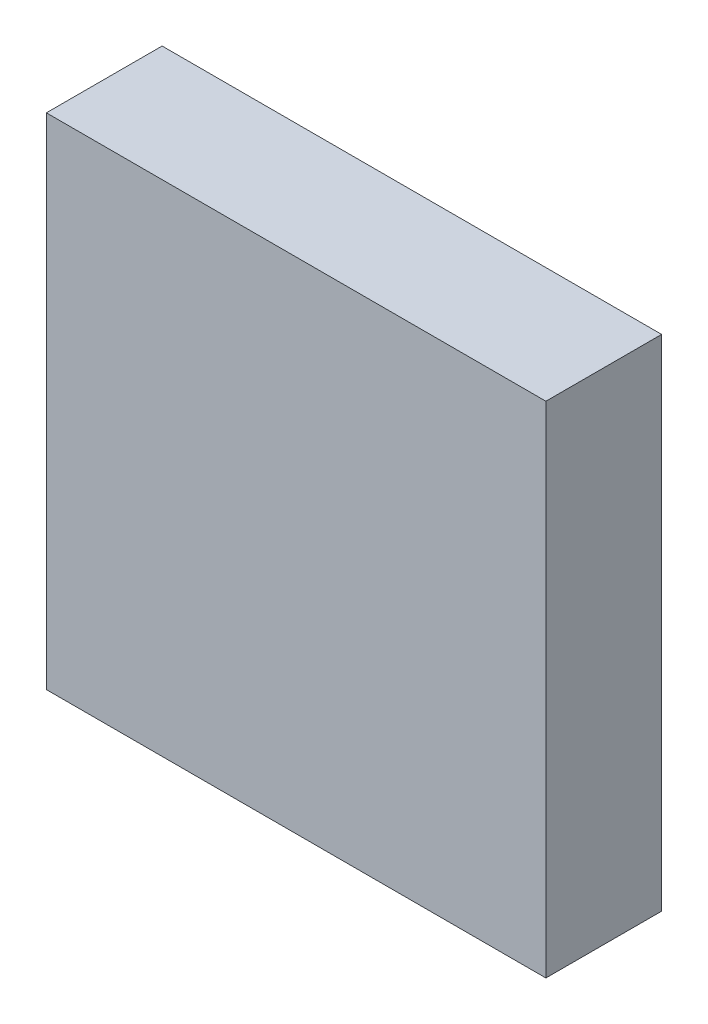
ISO-10303-21;
HEADER;
FILE_DESCRIPTION(('STEP AP214'),'2;1');
FILE_NAME('part.step','',(''),(''),'','','');
FILE_SCHEMA(('AUTOMOTIVE_DESIGN { 1 0 10303 214 1 1 1 1 }'));
ENDSEC;
DATA;
#1=APPLICATION_CONTEXT('core data for automotive mechanical design processes');
#2=APPLICATION_PROTOCOL_DEFINITION('international standard','automotive_design',2000,#1);
#3=PRODUCT_CONTEXT('',#1,'mechanical');
#4=PRODUCT('Part','Part','',(#3));
#5=PRODUCT_RELATED_PRODUCT_CATEGORY('part','',(#4));
#6=PRODUCT_DEFINITION_FORMATION('','',#4);
#7=PRODUCT_DEFINITION_CONTEXT('part definition',#1,'design');
#8=PRODUCT_DEFINITION('design','',#6,#7);
#9=PRODUCT_DEFINITION_SHAPE('','',#8);
#10=(LENGTH_UNIT() NAMED_UNIT(*) SI_UNIT(.MILLI.,.METRE.));
#11=(NAMED_UNIT(*) PLANE_ANGLE_UNIT() SI_UNIT($,.RADIAN.));
#12=(NAMED_UNIT(*) SI_UNIT($,.STERADIAN.) SOLID_ANGLE_UNIT());
#13=UNCERTAINTY_MEASURE_WITH_UNIT(LENGTH_MEASURE(1.E-05),#10,'distance_accuracy_value','');
#14=(GEOMETRIC_REPRESENTATION_CONTEXT(3) GLOBAL_UNCERTAINTY_ASSIGNED_CONTEXT((#13)) GLOBAL_UNIT_ASSIGNED_CONTEXT((#10,
#11,#12)) REPRESENTATION_CONTEXT('',''));
#15=CARTESIAN_POINT('',(0.,0.,0.));
#16=DIRECTION('',(0.,0.,1.));
#17=DIRECTION('',(1.,0.,0.));
#18=AXIS2_PLACEMENT_3D('',#15,#16,#17);
#19=CARTESIAN_POINT('',(2.05000098,-2.05000098,0.95000064));
#20=DIRECTION('',(0.,0.,1.));
#21=DIRECTION('',(1.,0.,0.));
#22=AXIS2_PLACEMENT_3D('',#19,#20,#21);
#23=PLANE('',#22);
#24=DIRECTION('',(0.,1.,0.));
#25=VECTOR('',#24,1.);
#26=CARTESIAN_POINT('',(-2.05000098,-2.05000098,0.95000064));
#27=LINE('',#26,#25);
#28=CARTESIAN_POINT('',(-2.05000098,-2.05000098,0.95000064));
#29=VERTEX_POINT('',#28);
#30=CARTESIAN_POINT('',(-2.05000098,2.05000098,0.95000064));
#31=VERTEX_POINT('',#30);
#32=EDGE_CURVE('E53',#29,#31,#27,.T.);
#33=ORIENTED_EDGE('',*,*,#32,.F.);
#34=DIRECTION('',(1.,0.,0.));
#35=VECTOR('',#34,1.);
#36=CARTESIAN_POINT('',(2.05000098,-2.05000098,0.95000064));
#37=LINE('',#36,#35);
#38=CARTESIAN_POINT('',(2.05000098,-2.05000098,0.95000064));
#39=VERTEX_POINT('',#38);
#40=EDGE_CURVE('E68',#39,#29,#37,.F.);
#41=ORIENTED_EDGE('',*,*,#40,.F.);
#42=DIRECTION('',(0.,1.,0.));
#43=VECTOR('',#42,1.);
#44=CARTESIAN_POINT('',(2.05000098,2.05000098,0.95000064));
#45=LINE('',#44,#43);
#46=CARTESIAN_POINT('',(2.05000098,2.05000098,0.95000064));
#47=VERTEX_POINT('',#46);
#48=EDGE_CURVE('E20',#47,#39,#45,.F.);
#49=ORIENTED_EDGE('',*,*,#48,.F.);
#50=DIRECTION('',(1.,0.,0.));
#51=VECTOR('',#50,1.);
#52=CARTESIAN_POINT('',(-2.05000098,2.05000098,0.95000064));
#53=LINE('',#52,#51);
#54=EDGE_CURVE('E58',#31,#47,#53,.T.);
#55=ORIENTED_EDGE('',*,*,#54,.F.);
#56=EDGE_LOOP('',(#33,#41,#49,#55));
#57=FACE_BOUND('',#56,.T.);
#58=ADVANCED_FACE('F17',(#57),#23,.T.);
#59=CARTESIAN_POINT('',(2.05000098,2.05000098,0.));
#60=DIRECTION('',(1.,0.,0.));
#61=DIRECTION('',(0.,0.,-1.));
#62=AXIS2_PLACEMENT_3D('',#59,#60,#61);
#63=PLANE('',#62);
#64=DIRECTION('',(0.,0.,-1.));
#65=VECTOR('',#64,1.);
#66=CARTESIAN_POINT('',(2.05000098,-2.05000098,0.));
#67=LINE('',#66,#65);
#68=CARTESIAN_POINT('',(2.05000098,-2.05000098,0.));
#69=VERTEX_POINT('',#68);
#70=EDGE_CURVE('E79',#69,#39,#67,.F.);
#71=ORIENTED_EDGE('',*,*,#70,.F.);
#72=DIRECTION('',(0.,1.,0.));
#73=VECTOR('',#72,1.);
#74=CARTESIAN_POINT('',(2.05000098,-2.05000098,0.));
#75=LINE('',#74,#73);
#76=CARTESIAN_POINT('',(2.05000098,2.05000098,0.));
#77=VERTEX_POINT('',#76);
#78=EDGE_CURVE('E74',#69,#77,#75,.T.);
#79=ORIENTED_EDGE('',*,*,#78,.T.);
#80=DIRECTION('',(0.,0.,1.));
#81=VECTOR('',#80,1.);
#82=CARTESIAN_POINT('',(2.05000098,2.05000098,0.));
#83=LINE('',#82,#81);
#84=EDGE_CURVE('E63',#47,#77,#83,.F.);
#85=ORIENTED_EDGE('',*,*,#84,.F.);
#86=ORIENTED_EDGE('',*,*,#48,.T.);
#87=EDGE_LOOP('',(#71,#79,#85,#86));
#88=FACE_BOUND('',#87,.T.);
#89=ADVANCED_FACE('F73',(#88),#63,.T.);
#90=CARTESIAN_POINT('',(-2.05000098,2.05000098,0.));
#91=DIRECTION('',(0.,1.,0.));
#92=DIRECTION('',(0.,0.,1.));
#93=AXIS2_PLACEMENT_3D('',#90,#91,#92);
#94=PLANE('',#93);
#95=ORIENTED_EDGE('',*,*,#84,.T.);
#96=DIRECTION('',(1.,0.,0.));
#97=VECTOR('',#96,1.);
#98=CARTESIAN_POINT('',(2.05000098,2.05000098,0.));
#99=LINE('',#98,#97);
#100=CARTESIAN_POINT('',(-2.05000098,2.05000098,0.));
#101=VERTEX_POINT('',#100);
#102=EDGE_CURVE('E84',#77,#101,#99,.F.);
#103=ORIENTED_EDGE('',*,*,#102,.T.);
#104=DIRECTION('',(0.,0.,1.));
#105=VECTOR('',#104,1.);
#106=CARTESIAN_POINT('',(-2.05000098,2.05000098,0.));
#107=LINE('',#106,#105);
#108=EDGE_CURVE('E65',#31,#101,#107,.F.);
#109=ORIENTED_EDGE('',*,*,#108,.F.);
#110=ORIENTED_EDGE('',*,*,#54,.T.);
#111=EDGE_LOOP('',(#95,#103,#109,#110));
#112=FACE_BOUND('',#111,.T.);
#113=ADVANCED_FACE('F60',(#112),#94,.T.);
#114=CARTESIAN_POINT('',(-2.05000098,-2.05000098,0.));
#115=DIRECTION('',(-1.,0.,0.));
#116=DIRECTION('',(0.,0.,1.));
#117=AXIS2_PLACEMENT_3D('',#114,#115,#116);
#118=PLANE('',#117);
#119=ORIENTED_EDGE('',*,*,#108,.T.);
#120=DIRECTION('',(0.,1.,0.));
#121=VECTOR('',#120,1.);
#122=CARTESIAN_POINT('',(-2.05000098,-2.05000098,0.));
#123=LINE('',#122,#121);
#124=CARTESIAN_POINT('',(-2.05000098,-2.05000098,0.));
#125=VERTEX_POINT('',#124);
#126=EDGE_CURVE('E26',#101,#125,#123,.F.);
#127=ORIENTED_EDGE('',*,*,#126,.T.);
#128=DIRECTION('',(0.,0.,-1.));
#129=VECTOR('',#128,1.);
#130=CARTESIAN_POINT('',(-2.05000098,-2.05000098,0.));
#131=LINE('',#130,#129);
#132=EDGE_CURVE('E34',#29,#125,#131,.T.);
#133=ORIENTED_EDGE('',*,*,#132,.F.);
#134=ORIENTED_EDGE('',*,*,#32,.T.);
#135=EDGE_LOOP('',(#119,#127,#133,#134));
#136=FACE_BOUND('',#135,.T.);
#137=ADVANCED_FACE('F88',(#136),#118,.T.);
#138=CARTESIAN_POINT('',(2.05000098,-2.05000098,0.));
#139=DIRECTION('',(0.,-1.,0.));
#140=DIRECTION('',(0.,0.,-1.));
#141=AXIS2_PLACEMENT_3D('',#138,#139,#140);
#142=PLANE('',#141);
#143=ORIENTED_EDGE('',*,*,#132,.T.);
#144=DIRECTION('',(1.,0.,0.));
#145=VECTOR('',#144,1.);
#146=CARTESIAN_POINT('',(2.05000098,-2.05000098,0.));
#147=LINE('',#146,#145);
#148=EDGE_CURVE('E11',#125,#69,#147,.T.);
#149=ORIENTED_EDGE('',*,*,#148,.T.);
#150=ORIENTED_EDGE('',*,*,#70,.T.);
#151=ORIENTED_EDGE('',*,*,#40,.T.);
#152=EDGE_LOOP('',(#143,#149,#150,#151));
#153=FACE_BOUND('',#152,.T.);
#154=ADVANCED_FACE('F91',(#153),#142,.T.);
#155=CARTESIAN_POINT('',(2.05000098,-2.05000098,0.));
#156=DIRECTION('',(0.,0.,1.));
#157=DIRECTION('',(1.,0.,0.));
#158=AXIS2_PLACEMENT_3D('',#155,#156,#157);
#159=PLANE('',#158);
#160=ORIENTED_EDGE('',*,*,#126,.F.);
#161=ORIENTED_EDGE('',*,*,#102,.F.);
#162=ORIENTED_EDGE('',*,*,#78,.F.);
#163=ORIENTED_EDGE('',*,*,#148,.F.);
#164=EDGE_LOOP('',(#160,#161,#162,#163));
#165=FACE_BOUND('',#164,.T.);
#166=ADVANCED_FACE('F90',(#165),#159,.F.);
#167=CLOSED_SHELL('',(#58,#89,#113,#137,#154,#166));
#168=MANIFOLD_SOLID_BREP('B1',#167);
#169=ADVANCED_BREP_SHAPE_REPRESENTATION('',(#18,#168),#14);
#170=SHAPE_DEFINITION_REPRESENTATION(#9,#169);
ENDSEC;
END-ISO-10303-21;
